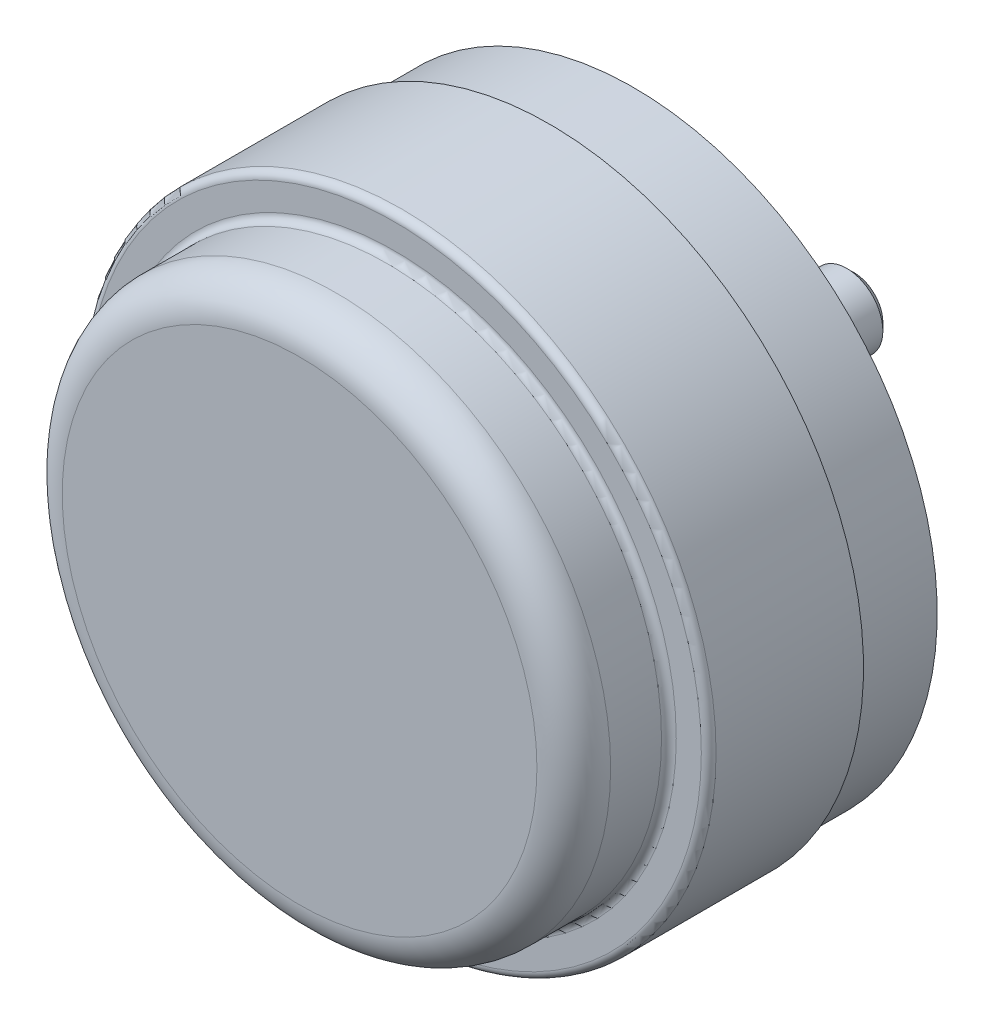
ISO-10303-21;
HEADER;
FILE_DESCRIPTION(('STEP AP214'),'2;1');
FILE_NAME('part.step','',(''),(''),'','','');
FILE_SCHEMA(('AUTOMOTIVE_DESIGN { 1 0 10303 214 1 1 1 1 }'));
ENDSEC;
DATA;
#1=APPLICATION_CONTEXT('core data for automotive mechanical design processes');
#2=APPLICATION_PROTOCOL_DEFINITION('international standard','automotive_design',2000,#1);
#3=PRODUCT_CONTEXT('',#1,'mechanical');
#4=PRODUCT('Part','Part','',(#3));
#5=PRODUCT_RELATED_PRODUCT_CATEGORY('part','',(#4));
#6=PRODUCT_DEFINITION_FORMATION('','',#4);
#7=PRODUCT_DEFINITION_CONTEXT('part definition',#1,'design');
#8=PRODUCT_DEFINITION('design','',#6,#7);
#9=PRODUCT_DEFINITION_SHAPE('','',#8);
#10=(LENGTH_UNIT() NAMED_UNIT(*) SI_UNIT(.MILLI.,.METRE.));
#11=(NAMED_UNIT(*) PLANE_ANGLE_UNIT() SI_UNIT($,.RADIAN.));
#12=(NAMED_UNIT(*) SI_UNIT($,.STERADIAN.) SOLID_ANGLE_UNIT());
#13=UNCERTAINTY_MEASURE_WITH_UNIT(LENGTH_MEASURE(1.E-05),#10,'distance_accuracy_value','');
#14=(GEOMETRIC_REPRESENTATION_CONTEXT(3) GLOBAL_UNCERTAINTY_ASSIGNED_CONTEXT((#13)) GLOBAL_UNIT_ASSIGNED_CONTEXT((#10,
#11,#12)) REPRESENTATION_CONTEXT('',''));
#15=CARTESIAN_POINT('',(0.,0.,0.));
#16=DIRECTION('',(0.,0.,1.));
#17=DIRECTION('',(1.,0.,0.));
#18=AXIS2_PLACEMENT_3D('',#15,#16,#17);
#19=CARTESIAN_POINT('',(0.,0.,11.5062));
#20=DIRECTION('',(0.,0.,1.));
#21=DIRECTION('',(1.,0.,0.));
#22=AXIS2_PLACEMENT_3D('',#19,#20,#21);
#23=PLANE('',#22);
#24=CARTESIAN_POINT('',(0.,0.,11.5062));
#25=DIRECTION('',(0.,0.,-1.));
#26=DIRECTION('',(1.,0.,0.));
#27=AXIS2_PLACEMENT_3D('',#24,#25,#26);
#28=CIRCLE('',#27,8.1788);
#29=CARTESIAN_POINT('',(8.1788,0.,11.5062));
#30=VERTEX_POINT('',#29);
#31=EDGE_CURVE('E63',#30,#30,#28,.T.);
#32=ORIENTED_EDGE('',*,*,#31,.F.);
#33=EDGE_LOOP('',(#32));
#34=FACE_BOUND('',#33,.T.);
#35=ADVANCED_FACE('F14',(#34),#23,.T.);
#36=CARTESIAN_POINT('',(5.18856131481163,5.33527621800786,-2.413));
#37=DIRECTION('',(0.,0.,-1.));
#38=DIRECTION('',(-1.,0.,0.));
#39=AXIS2_PLACEMENT_3D('',#36,#37,#38);
#40=PLANE('',#39);
#41=CARTESIAN_POINT('',(5.18856131481163,5.33527621800786,-2.41300000004685));
#42=DIRECTION('',(0.,0.,1.));
#43=DIRECTION('',(1.,0.,0.));
#44=AXIS2_PLACEMENT_3D('',#41,#42,#43);
#45=CIRCLE('',#44,0.990599999964508);
#46=CARTESIAN_POINT('',(6.17916131477614,5.33527621800786,-2.41300000004685));
#47=VERTEX_POINT('',#46);
#48=EDGE_CURVE('E18',#47,#47,#45,.T.);
#49=ORIENTED_EDGE('',*,*,#48,.F.);
#50=EDGE_LOOP('',(#49));
#51=FACE_BOUND('',#50,.T.);
#52=ADVANCED_FACE('F93',(#51),#40,.T.);
#53=CARTESIAN_POINT('',(-5.18856131481163,-5.33527621800786,-2.413));
#54=DIRECTION('',(0.,0.,-1.));
#55=DIRECTION('',(-1.,0.,0.));
#56=AXIS2_PLACEMENT_3D('',#53,#54,#55);
#57=PLANE('',#56);
#58=CARTESIAN_POINT('',(-5.18856131481163,-5.33527621800786,-2.41299999999001));
#59=DIRECTION('',(0.,0.,1.));
#60=DIRECTION('',(1.,0.,0.));
#61=AXIS2_PLACEMENT_3D('',#58,#59,#60);
#62=CIRCLE('',#61,0.990600000024295);
#63=CARTESIAN_POINT('',(-4.19796131478734,-5.33527621800786,-2.41299999999001));
#64=VERTEX_POINT('',#63);
#65=EDGE_CURVE('E56',#64,#64,#62,.T.);
#66=ORIENTED_EDGE('',*,*,#65,.F.);
#67=EDGE_LOOP('',(#66));
#68=FACE_BOUND('',#67,.T.);
#69=ADVANCED_FACE('F90',(#68),#57,.T.);
#70=CARTESIAN_POINT('',(0.,0.,10.2362));
#71=DIRECTION('',(0.,0.,1.));
#72=DIRECTION('',(1.,0.,0.));
#73=AXIS2_PLACEMENT_3D('',#70,#71,#72);
#74=TOROIDAL_SURFACE('',#73,8.1788,1.27);
#75=ORIENTED_EDGE('',*,*,#31,.T.);
#76=EDGE_LOOP('',(#75));
#77=FACE_BOUND('',#76,.T.);
#78=CARTESIAN_POINT('',(0.,0.,10.2362));
#79=DIRECTION('',(0.,0.,-1.));
#80=DIRECTION('',(-1.,0.,0.));
#81=AXIS2_PLACEMENT_3D('',#78,#79,#80);
#82=CIRCLE('',#81,9.4488);
#83=CARTESIAN_POINT('',(-9.4488,0.,10.2362));
#84=VERTEX_POINT('',#83);
#85=EDGE_CURVE('E55',#84,#84,#82,.T.);
#86=ORIENTED_EDGE('',*,*,#85,.F.);
#87=EDGE_LOOP('',(#86));
#88=FACE_BOUND('',#87,.T.);
#89=ADVANCED_FACE('F69',(#77,#88),#74,.T.);
#90=CARTESIAN_POINT('',(0.,0.,7.62));
#91=DIRECTION('',(0.,0.,1.));
#92=DIRECTION('',(1.,0.,0.));
#93=AXIS2_PLACEMENT_3D('',#90,#91,#92);
#94=PLANE('',#93);
#95=CARTESIAN_POINT('',(0.,0.,7.62));
#96=DIRECTION('',(0.,0.,-1.));
#97=DIRECTION('',(-1.,0.,0.));
#98=AXIS2_PLACEMENT_3D('',#95,#96,#97);
#99=CIRCLE('',#98,5.08);
#100=CARTESIAN_POINT('',(-5.08,0.,7.62));
#101=VERTEX_POINT('',#100);
#102=EDGE_CURVE('E52',#101,#101,#99,.T.);
#103=ORIENTED_EDGE('',*,*,#102,.T.);
#104=EDGE_LOOP('',(#103));
#105=FACE_BOUND('',#104,.T.);
#106=ADVANCED_FACE('F89',(#105),#94,.F.);
#107=CARTESIAN_POINT('',(5.18856131481163,5.33527621800786,-2.15899999989233));
#108=DIRECTION('',(0.,0.,1.));
#109=DIRECTION('',(1.,0.,0.));
#110=AXIS2_PLACEMENT_3D('',#107,#108,#109);
#111=CONICAL_SURFACE('',#110,1.24459999966428,0.785398162502276);
#112=ORIENTED_EDGE('',*,*,#48,.T.);
#113=EDGE_LOOP('',(#112));
#114=FACE_BOUND('',#113,.T.);
#115=CARTESIAN_POINT('',(5.18856131481163,5.33527621800786,-2.159));
#116=DIRECTION('',(0.,0.,1.));
#117=DIRECTION('',(1.,0.,0.));
#118=AXIS2_PLACEMENT_3D('',#115,#116,#117);
#119=CIRCLE('',#118,1.2446);
#120=CARTESIAN_POINT('',(6.43316131481163,5.33527621800786,-2.159));
#121=VERTEX_POINT('',#120);
#122=EDGE_CURVE('E54',#121,#121,#119,.T.);
#123=ORIENTED_EDGE('',*,*,#122,.F.);
#124=EDGE_LOOP('',(#123));
#125=FACE_BOUND('',#124,.T.);
#126=ADVANCED_FACE('F197',(#114,#125),#111,.T.);
#127=CARTESIAN_POINT('',(-5.18856131481163,-5.33527621800786,-2.15899999977864));
#128=DIRECTION('',(0.,0.,1.));
#129=DIRECTION('',(1.,0.,0.));
#130=AXIS2_PLACEMENT_3D('',#127,#128,#129);
#131=CONICAL_SURFACE('',#130,1.24459999978091,0.785398162502276);
#132=ORIENTED_EDGE('',*,*,#65,.T.);
#133=EDGE_LOOP('',(#132));
#134=FACE_BOUND('',#133,.T.);
#135=CARTESIAN_POINT('',(-5.18856131481163,-5.33527621800786,-2.159));
#136=DIRECTION('',(0.,0.,1.));
#137=DIRECTION('',(1.,0.,0.));
#138=AXIS2_PLACEMENT_3D('',#135,#136,#137);
#139=CIRCLE('',#138,1.2446);
#140=CARTESIAN_POINT('',(-3.94396131481163,-5.33527621800786,-2.159));
#141=VERTEX_POINT('',#140);
#142=EDGE_CURVE('E180',#141,#141,#139,.T.);
#143=ORIENTED_EDGE('',*,*,#142,.F.);
#144=EDGE_LOOP('',(#143));
#145=FACE_BOUND('',#144,.T.);
#146=ADVANCED_FACE('F199',(#134,#145),#131,.T.);
#147=CARTESIAN_POINT('',(0.,0.,9.8679));
#148=DIRECTION('',(0.,0.,-1.));
#149=DIRECTION('',(-1.,0.,0.));
#150=AXIS2_PLACEMENT_3D('',#147,#148,#149);
#151=CYLINDRICAL_SURFACE('',#150,9.4488);
#152=ORIENTED_EDGE('',*,*,#85,.T.);
#153=EDGE_LOOP('',(#152));
#154=FACE_BOUND('',#153,.T.);
#155=CARTESIAN_POINT('',(0.,0.,8.4836));
#156=DIRECTION('',(0.,0.,1.));
#157=DIRECTION('',(1.,0.,0.));
#158=AXIS2_PLACEMENT_3D('',#155,#156,#157);
#159=CIRCLE('',#158,9.4488);
#160=CARTESIAN_POINT('',(9.4488,0.,8.4836));
#161=VERTEX_POINT('',#160);
#162=EDGE_CURVE('E51',#161,#161,#159,.T.);
#163=ORIENTED_EDGE('',*,*,#162,.T.);
#164=EDGE_LOOP('',(#163));
#165=FACE_BOUND('',#164,.T.);
#166=ADVANCED_FACE('F204',(#154,#165),#151,.T.);
#167=CARTESIAN_POINT('',(0.,0.,0.));
#168=DIRECTION('',(0.,0.,-1.));
#169=DIRECTION('',(-1.,0.,0.));
#170=AXIS2_PLACEMENT_3D('',#167,#168,#169);
#171=CYLINDRICAL_SURFACE('',#170,5.08);
#172=CARTESIAN_POINT('',(0.,0.,0.));
#173=DIRECTION('',(0.,0.,-1.));
#174=DIRECTION('',(-1.,0.,0.));
#175=AXIS2_PLACEMENT_3D('',#172,#173,#174);
#176=CIRCLE('',#175,5.08);
#177=CARTESIAN_POINT('',(-5.08,0.,0.));
#178=VERTEX_POINT('',#177);
#179=EDGE_CURVE('E48',#178,#178,#176,.F.);
#180=ORIENTED_EDGE('',*,*,#179,.F.);
#181=EDGE_LOOP('',(#180));
#182=FACE_BOUND('',#181,.T.);
#183=ORIENTED_EDGE('',*,*,#102,.F.);
#184=EDGE_LOOP('',(#183));
#185=FACE_BOUND('',#184,.T.);
#186=ADVANCED_FACE('F210',(#182,#185),#171,.F.);
#187=CARTESIAN_POINT('',(5.18856131481163,5.33527621800786,0.));
#188=DIRECTION('',(0.,0.,1.));
#189=DIRECTION('',(1.,0.,0.));
#190=AXIS2_PLACEMENT_3D('',#187,#188,#189);
#191=CYLINDRICAL_SURFACE('',#190,1.2446);
#192=CARTESIAN_POINT('',(5.18856131481163,5.33527621800786,0.));
#193=DIRECTION('',(0.,0.,1.));
#194=DIRECTION('',(1.,0.,0.));
#195=AXIS2_PLACEMENT_3D('',#192,#193,#194);
#196=CIRCLE('',#195,1.2446);
#197=CARTESIAN_POINT('',(6.43316131481163,5.33527621800786,0.));
#198=VERTEX_POINT('',#197);
#199=EDGE_CURVE('E45',#198,#198,#196,.T.);
#200=ORIENTED_EDGE('',*,*,#199,.F.);
#201=EDGE_LOOP('',(#200));
#202=FACE_BOUND('',#201,.T.);
#203=ORIENTED_EDGE('',*,*,#122,.T.);
#204=EDGE_LOOP('',(#203));
#205=FACE_BOUND('',#204,.T.);
#206=ADVANCED_FACE('F195',(#202,#205),#191,.T.);
#207=CARTESIAN_POINT('',(-5.18856131481163,-5.33527621800786,0.));
#208=DIRECTION('',(0.,0.,1.));
#209=DIRECTION('',(1.,0.,0.));
#210=AXIS2_PLACEMENT_3D('',#207,#208,#209);
#211=CYLINDRICAL_SURFACE('',#210,1.2446);
#212=CARTESIAN_POINT('',(-5.18856131481163,-5.33527621800786,0.));
#213=DIRECTION('',(0.,0.,1.));
#214=DIRECTION('',(1.,0.,0.));
#215=AXIS2_PLACEMENT_3D('',#212,#213,#214);
#216=CIRCLE('',#215,1.2446);
#217=CARTESIAN_POINT('',(-3.94396131481163,-5.33527621800786,0.));
#218=VERTEX_POINT('',#217);
#219=EDGE_CURVE('E42',#218,#218,#216,.T.);
#220=ORIENTED_EDGE('',*,*,#219,.F.);
#221=EDGE_LOOP('',(#220));
#222=FACE_BOUND('',#221,.T.);
#223=ORIENTED_EDGE('',*,*,#142,.T.);
#224=EDGE_LOOP('',(#223));
#225=FACE_BOUND('',#224,.T.);
#226=ADVANCED_FACE('F172',(#222,#225),#211,.T.);
#227=CARTESIAN_POINT('',(0.,0.,8.4836));
#228=DIRECTION('',(0.,0.,1.));
#229=DIRECTION('',(1.,0.,0.));
#230=AXIS2_PLACEMENT_3D('',#227,#228,#229);
#231=TOROIDAL_SURFACE('',#230,9.7028,0.254);
#232=ORIENTED_EDGE('',*,*,#162,.F.);
#233=EDGE_LOOP('',(#232));
#234=FACE_BOUND('',#233,.T.);
#235=CARTESIAN_POINT('',(0.,0.,8.2296));
#236=DIRECTION('',(0.,0.,1.));
#237=DIRECTION('',(1.,0.,0.));
#238=AXIS2_PLACEMENT_3D('',#235,#236,#237);
#239=CIRCLE('',#238,9.7028);
#240=CARTESIAN_POINT('',(9.7028,0.,8.2296));
#241=VERTEX_POINT('',#240);
#242=EDGE_CURVE('E41',#241,#241,#239,.F.);
#243=ORIENTED_EDGE('',*,*,#242,.F.);
#244=EDGE_LOOP('',(#243));
#245=FACE_BOUND('',#244,.T.);
#246=ADVANCED_FACE('F168',(#234,#245),#231,.F.);
#247=CARTESIAN_POINT('',(0.,0.,0.));
#248=DIRECTION('',(0.,0.,-1.));
#249=DIRECTION('',(-1.,0.,0.));
#250=AXIS2_PLACEMENT_3D('',#247,#248,#249);
#251=PLANE('',#250);
#252=CARTESIAN_POINT('',(0.,0.,0.));
#253=DIRECTION('',(0.,0.,-1.));
#254=DIRECTION('',(-1.,0.,0.));
#255=AXIS2_PLACEMENT_3D('',#252,#253,#254);
#256=CIRCLE('',#255,10.4648);
#257=CARTESIAN_POINT('',(-10.4648,0.,0.));
#258=VERTEX_POINT('',#257);
#259=EDGE_CURVE('E38',#258,#258,#256,.F.);
#260=ORIENTED_EDGE('',*,*,#259,.F.);
#261=EDGE_LOOP('',(#260));
#262=FACE_BOUND('',#261,.T.);
#263=ORIENTED_EDGE('',*,*,#219,.T.);
#264=EDGE_LOOP('',(#263));
#265=FACE_BOUND('',#264,.T.);
#266=ORIENTED_EDGE('',*,*,#199,.T.);
#267=EDGE_LOOP('',(#266));
#268=FACE_BOUND('',#267,.T.);
#269=ORIENTED_EDGE('',*,*,#179,.T.);
#270=EDGE_LOOP('',(#269));
#271=FACE_BOUND('',#270,.T.);
#272=ADVANCED_FACE('F143',(#262,#265,#268,#271),#251,.T.);
#273=CARTESIAN_POINT('',(0.,0.,8.2296));
#274=DIRECTION('',(0.,0.,1.));
#275=DIRECTION('',(1.,0.,0.));
#276=AXIS2_PLACEMENT_3D('',#273,#274,#275);
#277=PLANE('',#276);
#278=CARTESIAN_POINT('',(0.,0.,8.2296));
#279=DIRECTION('',(0.,0.,-1.));
#280=DIRECTION('',(1.,0.,0.));
#281=AXIS2_PLACEMENT_3D('',#278,#279,#280);
#282=CIRCLE('',#281,10.5664);
#283=CARTESIAN_POINT('',(10.5664,0.,8.2296));
#284=VERTEX_POINT('',#283);
#285=EDGE_CURVE('E37',#284,#284,#282,.T.);
#286=ORIENTED_EDGE('',*,*,#285,.F.);
#287=EDGE_LOOP('',(#286));
#288=FACE_BOUND('',#287,.T.);
#289=ORIENTED_EDGE('',*,*,#242,.T.);
#290=EDGE_LOOP('',(#289));
#291=FACE_BOUND('',#290,.T.);
#292=ADVANCED_FACE('F134',(#288,#291),#277,.T.);
#293=CARTESIAN_POINT('',(0.,0.,1.4478));
#294=DIRECTION('',(0.,0.,-1.));
#295=DIRECTION('',(-1.,0.,0.));
#296=AXIS2_PLACEMENT_3D('',#293,#294,#295);
#297=CYLINDRICAL_SURFACE('',#296,10.4648);
#298=ORIENTED_EDGE('',*,*,#259,.T.);
#299=EDGE_LOOP('',(#298));
#300=FACE_BOUND('',#299,.T.);
#301=CARTESIAN_POINT('',(0.,0.,2.8956));
#302=DIRECTION('',(0.,0.,-1.));
#303=DIRECTION('',(-1.,0.,0.));
#304=AXIS2_PLACEMENT_3D('',#301,#302,#303);
#305=CIRCLE('',#304,10.4648);
#306=CARTESIAN_POINT('',(-10.4648,0.,2.8956));
#307=VERTEX_POINT('',#306);
#308=EDGE_CURVE('E27',#307,#307,#305,.T.);
#309=ORIENTED_EDGE('',*,*,#308,.T.);
#310=EDGE_LOOP('',(#309));
#311=FACE_BOUND('',#310,.T.);
#312=ADVANCED_FACE('F117',(#300,#311),#297,.T.);
#313=CARTESIAN_POINT('',(0.,0.,7.9756));
#314=DIRECTION('',(0.,0.,1.));
#315=DIRECTION('',(1.,0.,0.));
#316=AXIS2_PLACEMENT_3D('',#313,#314,#315);
#317=TOROIDAL_SURFACE('',#316,10.5664,0.254);
#318=CARTESIAN_POINT('',(0.,0.,7.9756));
#319=DIRECTION('',(0.,0.,-1.));
#320=DIRECTION('',(-1.,0.,0.));
#321=AXIS2_PLACEMENT_3D('',#318,#319,#320);
#322=CIRCLE('',#321,10.8204);
#323=CARTESIAN_POINT('',(-10.8204,0.,7.9756));
#324=VERTEX_POINT('',#323);
#325=EDGE_CURVE('E22',#324,#324,#322,.T.);
#326=ORIENTED_EDGE('',*,*,#325,.F.);
#327=EDGE_LOOP('',(#326));
#328=FACE_BOUND('',#327,.T.);
#329=ORIENTED_EDGE('',*,*,#285,.T.);
#330=EDGE_LOOP('',(#329));
#331=FACE_BOUND('',#330,.T.);
#332=ADVANCED_FACE('F108',(#328,#331),#317,.T.);
#333=CARTESIAN_POINT('',(0.,0.,2.8956));
#334=DIRECTION('',(0.,0.,1.));
#335=DIRECTION('',(1.,0.,0.));
#336=AXIS2_PLACEMENT_3D('',#333,#334,#335);
#337=PLANE('',#336);
#338=ORIENTED_EDGE('',*,*,#308,.F.);
#339=EDGE_LOOP('',(#338));
#340=FACE_BOUND('',#339,.T.);
#341=CARTESIAN_POINT('',(0.,0.,2.8956));
#342=DIRECTION('',(0.,0.,-1.));
#343=DIRECTION('',(-1.,0.,0.));
#344=AXIS2_PLACEMENT_3D('',#341,#342,#343);
#345=CIRCLE('',#344,10.8204);
#346=CARTESIAN_POINT('',(-10.8204,0.,2.8956));
#347=VERTEX_POINT('',#346);
#348=EDGE_CURVE('E10',#347,#347,#345,.F.);
#349=ORIENTED_EDGE('',*,*,#348,.F.);
#350=EDGE_LOOP('',(#349));
#351=FACE_BOUND('',#350,.T.);
#352=ADVANCED_FACE('F103',(#340,#351),#337,.F.);
#353=CARTESIAN_POINT('',(0.,0.,0.));
#354=DIRECTION('',(0.,0.,-1.));
#355=DIRECTION('',(-1.,0.,0.));
#356=AXIS2_PLACEMENT_3D('',#353,#354,#355);
#357=CYLINDRICAL_SURFACE('',#356,10.8204);
#358=ORIENTED_EDGE('',*,*,#348,.T.);
#359=EDGE_LOOP('',(#358));
#360=FACE_BOUND('',#359,.T.);
#361=ORIENTED_EDGE('',*,*,#325,.T.);
#362=EDGE_LOOP('',(#361));
#363=FACE_BOUND('',#362,.T.);
#364=ADVANCED_FACE('F101',(#360,#363),#357,.T.);
#365=CLOSED_SHELL('',(#35,#52,#69,#89,#106,#126,#146,#166,#186,#206,#226,#246,#272,#292,#312,
#332,#352,#364));
#366=MANIFOLD_SOLID_BREP('B1',#365);
#367=ADVANCED_BREP_SHAPE_REPRESENTATION('',(#18,#366),#14);
#368=SHAPE_DEFINITION_REPRESENTATION(#9,#367);
ENDSEC;
END-ISO-10303-21;
